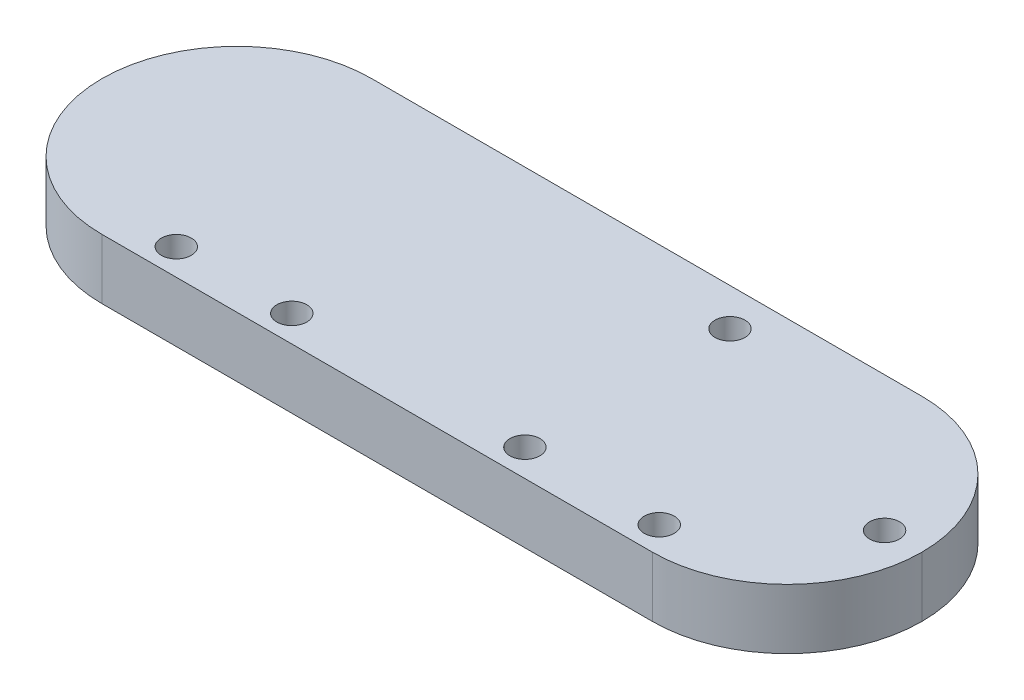
ISO-10303-21;
HEADER;
FILE_DESCRIPTION(('STEP AP214'),'2;1');
FILE_NAME('part.step','',(''),(''),'','','');
FILE_SCHEMA(('AUTOMOTIVE_DESIGN { 1 0 10303 214 1 1 1 1 }'));
ENDSEC;
DATA;
#1=APPLICATION_CONTEXT('core data for automotive mechanical design processes');
#2=APPLICATION_PROTOCOL_DEFINITION('international standard','automotive_design',2000,#1);
#3=PRODUCT_CONTEXT('',#1,'mechanical');
#4=PRODUCT('Part','Part','',(#3));
#5=PRODUCT_RELATED_PRODUCT_CATEGORY('part','',(#4));
#6=PRODUCT_DEFINITION_FORMATION('','',#4);
#7=PRODUCT_DEFINITION_CONTEXT('part definition',#1,'design');
#8=PRODUCT_DEFINITION('design','',#6,#7);
#9=PRODUCT_DEFINITION_SHAPE('','',#8);
#10=(LENGTH_UNIT() NAMED_UNIT(*) SI_UNIT(.MILLI.,.METRE.));
#11=(NAMED_UNIT(*) PLANE_ANGLE_UNIT() SI_UNIT($,.RADIAN.));
#12=(NAMED_UNIT(*) SI_UNIT($,.STERADIAN.) SOLID_ANGLE_UNIT());
#13=UNCERTAINTY_MEASURE_WITH_UNIT(LENGTH_MEASURE(1.E-05),#10,'distance_accuracy_value','');
#14=(GEOMETRIC_REPRESENTATION_CONTEXT(3) GLOBAL_UNCERTAINTY_ASSIGNED_CONTEXT((#13)) GLOBAL_UNIT_ASSIGNED_CONTEXT((#10,
#11,#12)) REPRESENTATION_CONTEXT('',''));
#15=CARTESIAN_POINT('',(0.,0.,0.));
#16=DIRECTION('',(0.,0.,1.));
#17=DIRECTION('',(1.,0.,0.));
#18=AXIS2_PLACEMENT_3D('',#15,#16,#17);
#19=CARTESIAN_POINT('',(-18.35,4.,-0.0100000000000031));
#20=DIRECTION('',(0.,-1.,0.));
#21=DIRECTION('',(0.,0.,-1.));
#22=AXIS2_PLACEMENT_3D('',#19,#20,#21);
#23=CYLINDRICAL_SURFACE('',#22,8.98);
#24=CARTESIAN_POINT('',(-18.35,0.,-0.0100000000000031));
#25=DIRECTION('',(0.,1.,0.));
#26=DIRECTION('',(0.,0.,1.));
#27=AXIS2_PLACEMENT_3D('',#24,#25,#26);
#28=CIRCLE('',#27,8.98);
#29=CARTESIAN_POINT('',(-18.3499999999999,0.,-8.99));
#30=VERTEX_POINT('',#29);
#31=CARTESIAN_POINT('',(-27.33,0.,-0.00999999999993714));
#32=VERTEX_POINT('',#31);
#33=EDGE_CURVE('E137',#30,#32,#28,.T.);
#34=ORIENTED_EDGE('',*,*,#33,.T.);
#35=DIRECTION('',(0.,-1.,0.));
#36=VECTOR('',#35,1.);
#37=CARTESIAN_POINT('',(-27.33,4.,-0.00999999999993714));
#38=LINE('',#37,#36);
#39=CARTESIAN_POINT('',(-27.33,4.,-0.00999999999993714));
#40=VERTEX_POINT('',#39);
#41=EDGE_CURVE('E11',#40,#32,#38,.T.);
#42=ORIENTED_EDGE('',*,*,#41,.F.);
#43=CARTESIAN_POINT('',(-18.35,4.,-0.0100000000000031));
#44=DIRECTION('',(0.,1.,0.));
#45=DIRECTION('',(0.,0.,1.));
#46=AXIS2_PLACEMENT_3D('',#43,#44,#45);
#47=CIRCLE('',#46,8.98);
#48=CARTESIAN_POINT('',(-18.3499999999999,4.,-8.99));
#49=VERTEX_POINT('',#48);
#50=EDGE_CURVE('E152',#49,#40,#47,.T.);
#51=ORIENTED_EDGE('',*,*,#50,.F.);
#52=DIRECTION('',(0.,-1.,0.));
#53=VECTOR('',#52,1.);
#54=CARTESIAN_POINT('',(-18.3499999999999,4.,-8.99));
#55=LINE('',#54,#53);
#56=EDGE_CURVE('E133',#49,#30,#55,.T.);
#57=ORIENTED_EDGE('',*,*,#56,.T.);
#58=EDGE_LOOP('',(#34,#42,#51,#57));
#59=FACE_BOUND('',#58,.T.);
#60=ADVANCED_FACE('F41',(#59),#23,.T.);
#61=CARTESIAN_POINT('',(-27.33,4.,0.00999999999993541));
#62=DIRECTION('',(1.,0.,0.));
#63=DIRECTION('',(0.,0.,-1.));
#64=AXIS2_PLACEMENT_3D('',#61,#62,#63);
#65=PLANE('',#64);
#66=DIRECTION('',(0.,0.,1.));
#67=VECTOR('',#66,1.);
#68=CARTESIAN_POINT('',(-27.33,0.,0.00999999999993541));
#69=LINE('',#68,#67);
#70=CARTESIAN_POINT('',(-27.33,0.,0.00999999999993587));
#71=VERTEX_POINT('',#70);
#72=EDGE_CURVE('E140',#32,#71,#69,.T.);
#73=ORIENTED_EDGE('',*,*,#72,.T.);
#74=DIRECTION('',(0.,-1.,0.));
#75=VECTOR('',#74,1.);
#76=CARTESIAN_POINT('',(-27.33,4.,0.00999999999993587));
#77=LINE('',#76,#75);
#78=CARTESIAN_POINT('',(-27.33,4.,0.00999999999993587));
#79=VERTEX_POINT('',#78);
#80=EDGE_CURVE('E49',#79,#71,#77,.T.);
#81=ORIENTED_EDGE('',*,*,#80,.F.);
#82=DIRECTION('',(0.,0.,1.));
#83=VECTOR('',#82,1.);
#84=CARTESIAN_POINT('',(-27.33,4.,0.00999999999993541));
#85=LINE('',#84,#83);
#86=EDGE_CURVE('E100',#40,#79,#85,.T.);
#87=ORIENTED_EDGE('',*,*,#86,.F.);
#88=ORIENTED_EDGE('',*,*,#41,.T.);
#89=EDGE_LOOP('',(#73,#81,#87,#88));
#90=FACE_BOUND('',#89,.T.);
#91=ADVANCED_FACE('F260',(#90),#65,.F.);
#92=CARTESIAN_POINT('',(-18.35,4.,0.0100000000000013));
#93=DIRECTION('',(0.,-1.,0.));
#94=DIRECTION('',(0.,0.,-1.));
#95=AXIS2_PLACEMENT_3D('',#92,#93,#94);
#96=CYLINDRICAL_SURFACE('',#95,8.98);
#97=CARTESIAN_POINT('',(-18.35,0.,0.0100000000000013));
#98=DIRECTION('',(0.,1.,0.));
#99=DIRECTION('',(0.,0.,1.));
#100=AXIS2_PLACEMENT_3D('',#97,#98,#99);
#101=CIRCLE('',#100,8.98);
#102=CARTESIAN_POINT('',(-18.3499999999999,0.,8.99));
#103=VERTEX_POINT('',#102);
#104=EDGE_CURVE('E143',#71,#103,#101,.T.);
#105=ORIENTED_EDGE('',*,*,#104,.T.);
#106=DIRECTION('',(0.,-1.,0.));
#107=VECTOR('',#106,1.);
#108=CARTESIAN_POINT('',(-18.3499999999999,4.,8.99));
#109=LINE('',#108,#107);
#110=CARTESIAN_POINT('',(-18.3499999999999,4.,8.99));
#111=VERTEX_POINT('',#110);
#112=EDGE_CURVE('E159',#111,#103,#109,.T.);
#113=ORIENTED_EDGE('',*,*,#112,.F.);
#114=CARTESIAN_POINT('',(-18.35,4.,0.0100000000000013));
#115=DIRECTION('',(0.,1.,0.));
#116=DIRECTION('',(0.,0.,1.));
#117=AXIS2_PLACEMENT_3D('',#114,#115,#116);
#118=CIRCLE('',#117,8.98);
#119=EDGE_CURVE('E167',#79,#111,#118,.T.);
#120=ORIENTED_EDGE('',*,*,#119,.F.);
#121=ORIENTED_EDGE('',*,*,#80,.T.);
#122=EDGE_LOOP('',(#105,#113,#120,#121));
#123=FACE_BOUND('',#122,.T.);
#124=ADVANCED_FACE('F165',(#123),#96,.T.);
#125=CARTESIAN_POINT('',(-18.3499999999999,4.,8.99));
#126=DIRECTION('',(0.,0.,-1.));
#127=DIRECTION('',(-1.,0.,0.));
#128=AXIS2_PLACEMENT_3D('',#125,#126,#127);
#129=PLANE('',#128);
#130=DIRECTION('',(1.,0.,0.));
#131=VECTOR('',#130,1.);
#132=CARTESIAN_POINT('',(-18.3499999999999,0.,8.99));
#133=LINE('',#132,#131);
#134=CARTESIAN_POINT('',(18.3499999999999,0.,8.99));
#135=VERTEX_POINT('',#134);
#136=EDGE_CURVE('E145',#103,#135,#133,.T.);
#137=ORIENTED_EDGE('',*,*,#136,.T.);
#138=DIRECTION('',(0.,-1.,0.));
#139=VECTOR('',#138,1.);
#140=CARTESIAN_POINT('',(18.3499999999999,4.,8.99));
#141=LINE('',#140,#139);
#142=CARTESIAN_POINT('',(18.3499999999999,4.,8.99));
#143=VERTEX_POINT('',#142);
#144=EDGE_CURVE('E156',#143,#135,#141,.T.);
#145=ORIENTED_EDGE('',*,*,#144,.F.);
#146=DIRECTION('',(1.,0.,0.));
#147=VECTOR('',#146,1.);
#148=CARTESIAN_POINT('',(-18.3499999999999,4.,8.99));
#149=LINE('',#148,#147);
#150=EDGE_CURVE('E179',#111,#143,#149,.T.);
#151=ORIENTED_EDGE('',*,*,#150,.F.);
#152=ORIENTED_EDGE('',*,*,#112,.T.);
#153=EDGE_LOOP('',(#137,#145,#151,#152));
#154=FACE_BOUND('',#153,.T.);
#155=ADVANCED_FACE('F175',(#154),#129,.F.);
#156=CARTESIAN_POINT('',(18.35,4.,0.0100000000000013));
#157=DIRECTION('',(0.,-1.,0.));
#158=DIRECTION('',(0.,0.,-1.));
#159=AXIS2_PLACEMENT_3D('',#156,#157,#158);
#160=CYLINDRICAL_SURFACE('',#159,8.98);
#161=CARTESIAN_POINT('',(18.35,0.,0.0100000000000013));
#162=DIRECTION('',(0.,1.,0.));
#163=DIRECTION('',(0.,0.,1.));
#164=AXIS2_PLACEMENT_3D('',#161,#162,#163);
#165=CIRCLE('',#164,8.98);
#166=CARTESIAN_POINT('',(27.33,0.,0.00999999999993541));
#167=VERTEX_POINT('',#166);
#168=EDGE_CURVE('E147',#135,#167,#165,.T.);
#169=ORIENTED_EDGE('',*,*,#168,.T.);
#170=DIRECTION('',(0.,-1.,0.));
#171=VECTOR('',#170,1.);
#172=CARTESIAN_POINT('',(27.33,4.,0.00999999999993541));
#173=LINE('',#172,#171);
#174=CARTESIAN_POINT('',(27.33,4.,0.00999999999993541));
#175=VERTEX_POINT('',#174);
#176=EDGE_CURVE('E128',#175,#167,#173,.T.);
#177=ORIENTED_EDGE('',*,*,#176,.F.);
#178=CARTESIAN_POINT('',(18.35,4.,0.0100000000000013));
#179=DIRECTION('',(0.,1.,0.));
#180=DIRECTION('',(0.,0.,1.));
#181=AXIS2_PLACEMENT_3D('',#178,#179,#180);
#182=CIRCLE('',#181,8.98);
#183=EDGE_CURVE('E119',#143,#175,#182,.T.);
#184=ORIENTED_EDGE('',*,*,#183,.F.);
#185=ORIENTED_EDGE('',*,*,#144,.T.);
#186=EDGE_LOOP('',(#169,#177,#184,#185));
#187=FACE_BOUND('',#186,.T.);
#188=ADVANCED_FACE('F178',(#187),#160,.T.);
#189=CARTESIAN_POINT('',(27.33,4.,0.00999999999993541));
#190=DIRECTION('',(-1.,0.,0.));
#191=DIRECTION('',(0.,0.,1.));
#192=AXIS2_PLACEMENT_3D('',#189,#190,#191);
#193=PLANE('',#192);
#194=DIRECTION('',(0.,0.,-1.));
#195=VECTOR('',#194,1.);
#196=CARTESIAN_POINT('',(27.33,0.,0.00999999999993541));
#197=LINE('',#196,#195);
#198=CARTESIAN_POINT('',(27.33,0.,-0.00999999999993671));
#199=VERTEX_POINT('',#198);
#200=EDGE_CURVE('E127',#167,#199,#197,.T.);
#201=ORIENTED_EDGE('',*,*,#200,.T.);
#202=DIRECTION('',(0.,-1.,0.));
#203=VECTOR('',#202,1.);
#204=CARTESIAN_POINT('',(27.33,4.,-0.00999999999993671));
#205=LINE('',#204,#203);
#206=CARTESIAN_POINT('',(27.33,4.,-0.00999999999993671));
#207=VERTEX_POINT('',#206);
#208=EDGE_CURVE('E124',#207,#199,#205,.T.);
#209=ORIENTED_EDGE('',*,*,#208,.F.);
#210=DIRECTION('',(0.,0.,-1.));
#211=VECTOR('',#210,1.);
#212=CARTESIAN_POINT('',(27.33,4.,0.00999999999993541));
#213=LINE('',#212,#211);
#214=EDGE_CURVE('E113',#175,#207,#213,.T.);
#215=ORIENTED_EDGE('',*,*,#214,.F.);
#216=ORIENTED_EDGE('',*,*,#176,.T.);
#217=EDGE_LOOP('',(#201,#209,#215,#216));
#218=FACE_BOUND('',#217,.T.);
#219=ADVANCED_FACE('F125',(#218),#193,.F.);
#220=CARTESIAN_POINT('',(18.35,4.,-0.0100000000000031));
#221=DIRECTION('',(0.,-1.,0.));
#222=DIRECTION('',(0.,0.,-1.));
#223=AXIS2_PLACEMENT_3D('',#220,#221,#222);
#224=CYLINDRICAL_SURFACE('',#223,8.98);
#225=CARTESIAN_POINT('',(18.35,0.,-0.0100000000000031));
#226=DIRECTION('',(0.,1.,0.));
#227=DIRECTION('',(0.,0.,1.));
#228=AXIS2_PLACEMENT_3D('',#225,#226,#227);
#229=CIRCLE('',#228,8.98);
#230=CARTESIAN_POINT('',(18.3499999999999,0.,-8.99));
#231=VERTEX_POINT('',#230);
#232=EDGE_CURVE('E86',#199,#231,#229,.T.);
#233=ORIENTED_EDGE('',*,*,#232,.T.);
#234=DIRECTION('',(0.,-1.,0.));
#235=VECTOR('',#234,1.);
#236=CARTESIAN_POINT('',(18.3499999999999,4.,-8.99));
#237=LINE('',#236,#235);
#238=CARTESIAN_POINT('',(18.3499999999999,4.,-8.99));
#239=VERTEX_POINT('',#238);
#240=EDGE_CURVE('E129',#239,#231,#237,.T.);
#241=ORIENTED_EDGE('',*,*,#240,.F.);
#242=CARTESIAN_POINT('',(18.35,4.,-0.0100000000000031));
#243=DIRECTION('',(0.,1.,0.));
#244=DIRECTION('',(0.,0.,1.));
#245=AXIS2_PLACEMENT_3D('',#242,#243,#244);
#246=CIRCLE('',#245,8.98);
#247=EDGE_CURVE('E117',#207,#239,#246,.T.);
#248=ORIENTED_EDGE('',*,*,#247,.F.);
#249=ORIENTED_EDGE('',*,*,#208,.T.);
#250=EDGE_LOOP('',(#233,#241,#248,#249));
#251=FACE_BOUND('',#250,.T.);
#252=ADVANCED_FACE('F131',(#251),#224,.T.);
#253=CARTESIAN_POINT('',(-18.3499999999999,4.,-8.99));
#254=DIRECTION('',(0.,0.,1.));
#255=DIRECTION('',(1.,0.,0.));
#256=AXIS2_PLACEMENT_3D('',#253,#254,#255);
#257=PLANE('',#256);
#258=DIRECTION('',(-1.,0.,0.));
#259=VECTOR('',#258,1.);
#260=CARTESIAN_POINT('',(-18.3499999999999,0.,-8.99));
#261=LINE('',#260,#259);
#262=EDGE_CURVE('E92',#231,#30,#261,.T.);
#263=ORIENTED_EDGE('',*,*,#262,.T.);
#264=ORIENTED_EDGE('',*,*,#56,.F.);
#265=DIRECTION('',(-1.,0.,0.));
#266=VECTOR('',#265,1.);
#267=CARTESIAN_POINT('',(-18.3499999999999,4.,-8.99));
#268=LINE('',#267,#266);
#269=EDGE_CURVE('E57',#239,#49,#268,.T.);
#270=ORIENTED_EDGE('',*,*,#269,.F.);
#271=ORIENTED_EDGE('',*,*,#240,.T.);
#272=EDGE_LOOP('',(#263,#264,#270,#271));
#273=FACE_BOUND('',#272,.T.);
#274=ADVANCED_FACE('F232',(#273),#257,.F.);
#275=CARTESIAN_POINT('',(-18.35,4.,-0.0100000000000031));
#276=DIRECTION('',(0.,1.,0.));
#277=DIRECTION('',(0.,0.,1.));
#278=AXIS2_PLACEMENT_3D('',#275,#276,#277);
#279=PLANE('',#278);
#280=CARTESIAN_POINT('',(24.8300310357305,4.,-0.00245703372340768));
#281=DIRECTION('',(0.,1.,0.));
#282=DIRECTION('',(0.,0.,1.));
#283=AXIS2_PLACEMENT_3D('',#280,#281,#282);
#284=CIRCLE('',#283,1.);
#285=CARTESIAN_POINT('',(24.8300310357305,4.,0.997542966276594));
#286=VERTEX_POINT('',#285);
#287=EDGE_CURVE('E198',#286,#286,#284,.T.);
#288=ORIENTED_EDGE('',*,*,#287,.F.);
#289=EDGE_LOOP('',(#288));
#290=FACE_BOUND('',#289,.T.);
#291=CARTESIAN_POINT('',(-7.45208886237194,4.,7.22512650285175));
#292=DIRECTION('',(0.,1.,0.));
#293=DIRECTION('',(0.,0.,1.));
#294=AXIS2_PLACEMENT_3D('',#291,#292,#293);
#295=CIRCLE('',#294,1.);
#296=CARTESIAN_POINT('',(-7.45208886237194,4.,8.22512650285175));
#297=VERTEX_POINT('',#296);
#298=EDGE_CURVE('E203',#297,#297,#295,.T.);
#299=ORIENTED_EDGE('',*,*,#298,.F.);
#300=EDGE_LOOP('',(#299));
#301=FACE_BOUND('',#300,.T.);
#302=CARTESIAN_POINT('',(8.04003103573049,4.,-6.49));
#303=DIRECTION('',(0.,1.,0.));
#304=DIRECTION('',(0.,0.,1.));
#305=AXIS2_PLACEMENT_3D('',#302,#303,#304);
#306=CIRCLE('',#305,1.);
#307=CARTESIAN_POINT('',(8.04003103573049,4.,-5.49));
#308=VERTEX_POINT('',#307);
#309=EDGE_CURVE('E195',#308,#308,#306,.T.);
#310=ORIENTED_EDGE('',*,*,#309,.F.);
#311=EDGE_LOOP('',(#310));
#312=FACE_BOUND('',#311,.T.);
#313=CARTESIAN_POINT('',(16.9931507436458,4.,7.17903396978892));
#314=DIRECTION('',(0.,1.,0.));
#315=DIRECTION('',(0.,0.,1.));
#316=AXIS2_PLACEMENT_3D('',#313,#314,#315);
#317=CIRCLE('',#316,1.);
#318=CARTESIAN_POINT('',(16.9931507436458,4.,8.17903396978892));
#319=VERTEX_POINT('',#318);
#320=EDGE_CURVE('E188',#319,#319,#317,.T.);
#321=ORIENTED_EDGE('',*,*,#320,.F.);
#322=EDGE_LOOP('',(#321));
#323=FACE_BOUND('',#322,.T.);
#324=CARTESIAN_POINT('',(8.04003103573049,4.,7.17903396978892));
#325=DIRECTION('',(0.,1.,0.));
#326=DIRECTION('',(0.,0.,1.));
#327=AXIS2_PLACEMENT_3D('',#324,#325,#326);
#328=CIRCLE('',#327,1.);
#329=CARTESIAN_POINT('',(8.04003103573049,4.,8.17903396978892));
#330=VERTEX_POINT('',#329);
#331=EDGE_CURVE('E189',#330,#330,#328,.T.);
#332=ORIENTED_EDGE('',*,*,#331,.F.);
#333=EDGE_LOOP('',(#332));
#334=FACE_BOUND('',#333,.T.);
#335=CARTESIAN_POINT('',(-15.1511154163035,4.,7.22512650285175));
#336=DIRECTION('',(0.,1.,0.));
#337=DIRECTION('',(0.,0.,1.));
#338=AXIS2_PLACEMENT_3D('',#335,#336,#337);
#339=CIRCLE('',#338,1.);
#340=CARTESIAN_POINT('',(-15.1511154163035,4.,8.22512650285175));
#341=VERTEX_POINT('',#340);
#342=EDGE_CURVE('E202',#341,#341,#339,.T.);
#343=ORIENTED_EDGE('',*,*,#342,.F.);
#344=EDGE_LOOP('',(#343));
#345=FACE_BOUND('',#344,.T.);
#346=ORIENTED_EDGE('',*,*,#50,.T.);
#347=ORIENTED_EDGE('',*,*,#86,.T.);
#348=ORIENTED_EDGE('',*,*,#119,.T.);
#349=ORIENTED_EDGE('',*,*,#150,.T.);
#350=ORIENTED_EDGE('',*,*,#183,.T.);
#351=ORIENTED_EDGE('',*,*,#214,.T.);
#352=ORIENTED_EDGE('',*,*,#247,.T.);
#353=ORIENTED_EDGE('',*,*,#269,.T.);
#354=EDGE_LOOP('',(#346,#347,#348,#349,#350,#351,#352,#353));
#355=FACE_BOUND('',#354,.T.);
#356=ADVANCED_FACE('F115',(#290,#301,#312,#323,#334,#345,#355),#279,.T.);
#357=CARTESIAN_POINT('',(-18.35,0.,-0.0100000000000031));
#358=DIRECTION('',(0.,1.,0.));
#359=DIRECTION('',(0.,0.,1.));
#360=AXIS2_PLACEMENT_3D('',#357,#358,#359);
#361=PLANE('',#360);
#362=CARTESIAN_POINT('',(24.8300310357305,0.,-0.00245703372340768));
#363=DIRECTION('',(0.,1.,0.));
#364=DIRECTION('',(0.,0.,1.));
#365=AXIS2_PLACEMENT_3D('',#362,#363,#364);
#366=CIRCLE('',#365,1.);
#367=CARTESIAN_POINT('',(24.8300310357305,0.,0.997542966276594));
#368=VERTEX_POINT('',#367);
#369=EDGE_CURVE('E141',#368,#368,#366,.T.);
#370=ORIENTED_EDGE('',*,*,#369,.T.);
#371=EDGE_LOOP('',(#370));
#372=FACE_BOUND('',#371,.T.);
#373=CARTESIAN_POINT('',(-7.45208886237194,0.,7.22512650285175));
#374=DIRECTION('',(0.,1.,0.));
#375=DIRECTION('',(0.,0.,1.));
#376=AXIS2_PLACEMENT_3D('',#373,#374,#375);
#377=CIRCLE('',#376,1.);
#378=CARTESIAN_POINT('',(-7.45208886237194,0.,8.22512650285175));
#379=VERTEX_POINT('',#378);
#380=EDGE_CURVE('E211',#379,#379,#377,.T.);
#381=ORIENTED_EDGE('',*,*,#380,.T.);
#382=EDGE_LOOP('',(#381));
#383=FACE_BOUND('',#382,.T.);
#384=CARTESIAN_POINT('',(8.04003103573049,0.,-6.49));
#385=DIRECTION('',(0.,1.,0.));
#386=DIRECTION('',(0.,0.,1.));
#387=AXIS2_PLACEMENT_3D('',#384,#385,#386);
#388=CIRCLE('',#387,1.);
#389=CARTESIAN_POINT('',(8.04003103573049,0.,-5.49));
#390=VERTEX_POINT('',#389);
#391=EDGE_CURVE('E192',#390,#390,#388,.T.);
#392=ORIENTED_EDGE('',*,*,#391,.T.);
#393=EDGE_LOOP('',(#392));
#394=FACE_BOUND('',#393,.T.);
#395=CARTESIAN_POINT('',(16.9931507436458,0.,7.17903396978892));
#396=DIRECTION('',(0.,1.,0.));
#397=DIRECTION('',(0.,0.,1.));
#398=AXIS2_PLACEMENT_3D('',#395,#396,#397);
#399=CIRCLE('',#398,1.);
#400=CARTESIAN_POINT('',(16.9931507436458,0.,8.17903396978892));
#401=VERTEX_POINT('',#400);
#402=EDGE_CURVE('E185',#401,#401,#399,.T.);
#403=ORIENTED_EDGE('',*,*,#402,.T.);
#404=EDGE_LOOP('',(#403));
#405=FACE_BOUND('',#404,.T.);
#406=CARTESIAN_POINT('',(8.04003103573049,0.,7.17903396978892));
#407=DIRECTION('',(0.,1.,0.));
#408=DIRECTION('',(0.,0.,1.));
#409=AXIS2_PLACEMENT_3D('',#406,#407,#408);
#410=CIRCLE('',#409,1.);
#411=CARTESIAN_POINT('',(8.04003103573049,0.,8.17903396978892));
#412=VERTEX_POINT('',#411);
#413=EDGE_CURVE('E206',#412,#412,#410,.T.);
#414=ORIENTED_EDGE('',*,*,#413,.T.);
#415=EDGE_LOOP('',(#414));
#416=FACE_BOUND('',#415,.T.);
#417=CARTESIAN_POINT('',(-15.1511154163035,0.,7.22512650285175));
#418=DIRECTION('',(0.,1.,0.));
#419=DIRECTION('',(0.,0.,1.));
#420=AXIS2_PLACEMENT_3D('',#417,#418,#419);
#421=CIRCLE('',#420,1.);
#422=CARTESIAN_POINT('',(-15.1511154163035,0.,8.22512650285175));
#423=VERTEX_POINT('',#422);
#424=EDGE_CURVE('E199',#423,#423,#421,.T.);
#425=ORIENTED_EDGE('',*,*,#424,.T.);
#426=EDGE_LOOP('',(#425));
#427=FACE_BOUND('',#426,.T.);
#428=ORIENTED_EDGE('',*,*,#33,.F.);
#429=ORIENTED_EDGE('',*,*,#262,.F.);
#430=ORIENTED_EDGE('',*,*,#232,.F.);
#431=ORIENTED_EDGE('',*,*,#200,.F.);
#432=ORIENTED_EDGE('',*,*,#168,.F.);
#433=ORIENTED_EDGE('',*,*,#136,.F.);
#434=ORIENTED_EDGE('',*,*,#104,.F.);
#435=ORIENTED_EDGE('',*,*,#72,.F.);
#436=EDGE_LOOP('',(#428,#429,#430,#431,#432,#433,#434,#435));
#437=FACE_BOUND('',#436,.T.);
#438=ADVANCED_FACE('F171',(#372,#383,#394,#405,#416,#427,#437),#361,.F.);
#439=CARTESIAN_POINT('',(-15.1511154163035,0.,7.22512650285175));
#440=DIRECTION('',(0.,1.,0.));
#441=DIRECTION('',(0.,0.,1.));
#442=AXIS2_PLACEMENT_3D('',#439,#440,#441);
#443=CYLINDRICAL_SURFACE('',#442,1.);
#444=ORIENTED_EDGE('',*,*,#424,.F.);
#445=EDGE_LOOP('',(#444));
#446=FACE_BOUND('',#445,.T.);
#447=ORIENTED_EDGE('',*,*,#342,.T.);
#448=EDGE_LOOP('',(#447));
#449=FACE_BOUND('',#448,.T.);
#450=ADVANCED_FACE('F244',(#446,#449),#443,.F.);
#451=CARTESIAN_POINT('',(8.04003103573049,0.,7.17903396978892));
#452=DIRECTION('',(0.,1.,0.));
#453=DIRECTION('',(0.,0.,1.));
#454=AXIS2_PLACEMENT_3D('',#451,#452,#453);
#455=CYLINDRICAL_SURFACE('',#454,1.);
#456=ORIENTED_EDGE('',*,*,#413,.F.);
#457=EDGE_LOOP('',(#456));
#458=FACE_BOUND('',#457,.T.);
#459=ORIENTED_EDGE('',*,*,#331,.T.);
#460=EDGE_LOOP('',(#459));
#461=FACE_BOUND('',#460,.T.);
#462=ADVANCED_FACE('F246',(#458,#461),#455,.F.);
#463=CARTESIAN_POINT('',(16.9931507436458,0.,7.17903396978892));
#464=DIRECTION('',(0.,1.,0.));
#465=DIRECTION('',(0.,0.,1.));
#466=AXIS2_PLACEMENT_3D('',#463,#464,#465);
#467=CYLINDRICAL_SURFACE('',#466,1.);
#468=ORIENTED_EDGE('',*,*,#402,.F.);
#469=EDGE_LOOP('',(#468));
#470=FACE_BOUND('',#469,.T.);
#471=ORIENTED_EDGE('',*,*,#320,.T.);
#472=EDGE_LOOP('',(#471));
#473=FACE_BOUND('',#472,.T.);
#474=ADVANCED_FACE('F253',(#470,#473),#467,.F.);
#475=CARTESIAN_POINT('',(8.04003103573049,0.,-6.49));
#476=DIRECTION('',(0.,1.,0.));
#477=DIRECTION('',(0.,0.,1.));
#478=AXIS2_PLACEMENT_3D('',#475,#476,#477);
#479=CYLINDRICAL_SURFACE('',#478,1.);
#480=ORIENTED_EDGE('',*,*,#391,.F.);
#481=EDGE_LOOP('',(#480));
#482=FACE_BOUND('',#481,.T.);
#483=ORIENTED_EDGE('',*,*,#309,.T.);
#484=EDGE_LOOP('',(#483));
#485=FACE_BOUND('',#484,.T.);
#486=ADVANCED_FACE('F341',(#482,#485),#479,.F.);
#487=CARTESIAN_POINT('',(-7.45208886237194,0.,7.22512650285175));
#488=DIRECTION('',(0.,1.,0.));
#489=DIRECTION('',(0.,0.,1.));
#490=AXIS2_PLACEMENT_3D('',#487,#488,#489);
#491=CYLINDRICAL_SURFACE('',#490,1.);
#492=ORIENTED_EDGE('',*,*,#380,.F.);
#493=EDGE_LOOP('',(#492));
#494=FACE_BOUND('',#493,.T.);
#495=ORIENTED_EDGE('',*,*,#298,.T.);
#496=EDGE_LOOP('',(#495));
#497=FACE_BOUND('',#496,.T.);
#498=ADVANCED_FACE('F226',(#494,#497),#491,.F.);
#499=CARTESIAN_POINT('',(24.8300310357305,0.,-0.00245703372340768));
#500=DIRECTION('',(0.,1.,0.));
#501=DIRECTION('',(0.,0.,1.));
#502=AXIS2_PLACEMENT_3D('',#499,#500,#501);
#503=CYLINDRICAL_SURFACE('',#502,1.);
#504=ORIENTED_EDGE('',*,*,#369,.F.);
#505=EDGE_LOOP('',(#504));
#506=FACE_BOUND('',#505,.T.);
#507=ORIENTED_EDGE('',*,*,#287,.T.);
#508=EDGE_LOOP('',(#507));
#509=FACE_BOUND('',#508,.T.);
#510=ADVANCED_FACE('F223',(#506,#509),#503,.F.);
#511=CLOSED_SHELL('',(#60,#91,#124,#155,#188,#219,#252,#274,#356,#438,#450,#462,#474,#486,#498,#510));
#512=MANIFOLD_SOLID_BREP('B2',#511);
#513=ADVANCED_BREP_SHAPE_REPRESENTATION('',(#18,#512),#14);
#514=SHAPE_DEFINITION_REPRESENTATION(#9,#513);
ENDSEC;
END-ISO-10303-21;
